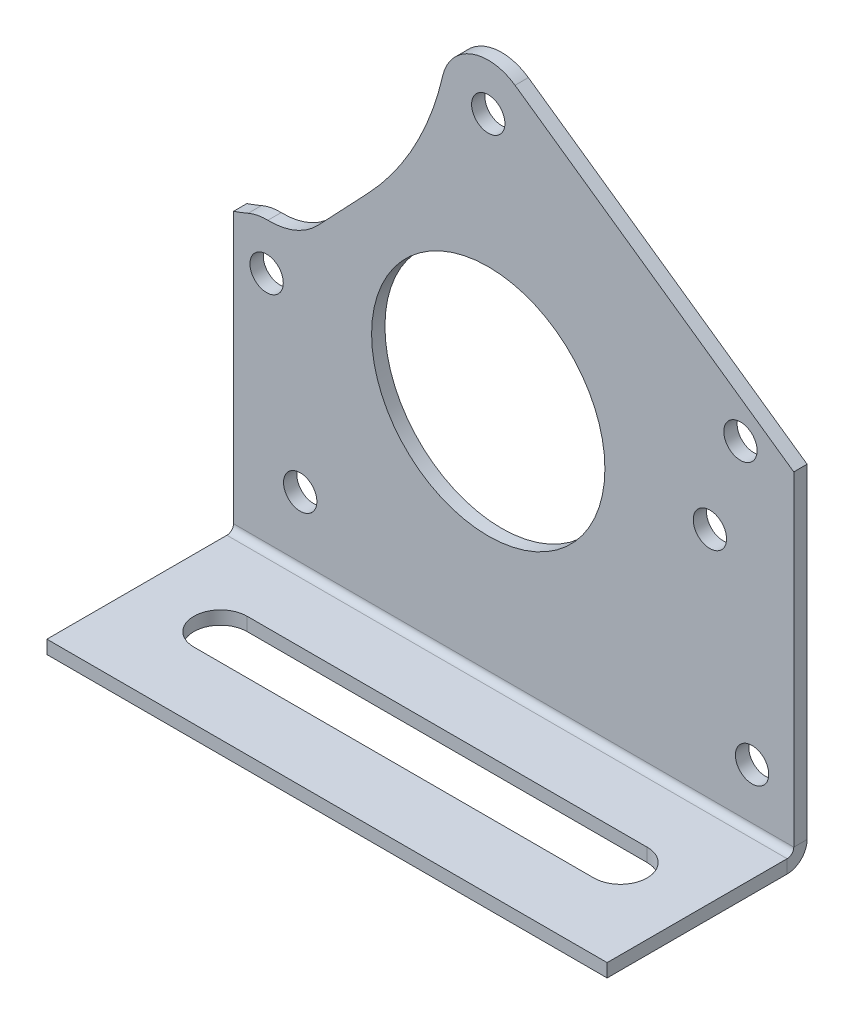
ISO-10303-21;
HEADER;
FILE_DESCRIPTION(('STEP AP214'),'2;1');
FILE_NAME('part.step','',(''),(''),'','','');
FILE_SCHEMA(('AUTOMOTIVE_DESIGN { 1 0 10303 214 1 1 1 1 }'));
ENDSEC;
DATA;
#1=APPLICATION_CONTEXT('core data for automotive mechanical design processes');
#2=APPLICATION_PROTOCOL_DEFINITION('international standard','automotive_design',2000,#1);
#3=PRODUCT_CONTEXT('',#1,'mechanical');
#4=PRODUCT('Part','Part','',(#3));
#5=PRODUCT_RELATED_PRODUCT_CATEGORY('part','',(#4));
#6=PRODUCT_DEFINITION_FORMATION('','',#4);
#7=PRODUCT_DEFINITION_CONTEXT('part definition',#1,'design');
#8=PRODUCT_DEFINITION('design','',#6,#7);
#9=PRODUCT_DEFINITION_SHAPE('','',#8);
#10=(LENGTH_UNIT() NAMED_UNIT(*) SI_UNIT(.MILLI.,.METRE.));
#11=(NAMED_UNIT(*) PLANE_ANGLE_UNIT() SI_UNIT($,.RADIAN.));
#12=(NAMED_UNIT(*) SI_UNIT($,.STERADIAN.) SOLID_ANGLE_UNIT());
#13=UNCERTAINTY_MEASURE_WITH_UNIT(LENGTH_MEASURE(1.E-05),#10,'distance_accuracy_value','');
#14=(GEOMETRIC_REPRESENTATION_CONTEXT(3) GLOBAL_UNCERTAINTY_ASSIGNED_CONTEXT((#13)) GLOBAL_UNIT_ASSIGNED_CONTEXT((#10,
#11,#12)) REPRESENTATION_CONTEXT('',''));
#15=CARTESIAN_POINT('',(0.,0.,0.));
#16=DIRECTION('',(0.,0.,1.));
#17=DIRECTION('',(1.,0.,0.));
#18=AXIS2_PLACEMENT_3D('',#15,#16,#17);
#19=CARTESIAN_POINT('',(-47.8445195193264,34.,0.));
#20=DIRECTION('',(0.,0.,1.));
#21=DIRECTION('',(1.,0.,0.));
#22=AXIS2_PLACEMENT_3D('',#19,#20,#21);
#23=CYLINDRICAL_SURFACE('',#22,30.);
#24=CARTESIAN_POINT('',(-47.8445195193264,34.,0.));
#25=DIRECTION('',(0.,0.,1.));
#26=DIRECTION('',(1.,0.,0.));
#27=AXIS2_PLACEMENT_3D('',#24,#25,#26);
#28=CIRCLE('',#27,30.);
#29=CARTESIAN_POINT('',(-38.2097610551975,5.58923743828941,0.));
#30=VERTEX_POINT('',#29);
#31=CARTESIAN_POINT('',(-36.0111253144672,6.43243243243244,0.));
#32=VERTEX_POINT('',#31);
#33=EDGE_CURVE('E236',#30,#32,#28,.T.);
#34=ORIENTED_EDGE('',*,*,#33,.F.);
#35=DIRECTION('',(0.,0.,-1.));
#36=VECTOR('',#35,1.);
#37=CARTESIAN_POINT('',(-38.2097610551975,5.58923743828941,2.));
#38=LINE('',#37,#36);
#39=CARTESIAN_POINT('',(-38.2097610551975,5.58923743828941,2.));
#40=VERTEX_POINT('',#39);
#41=EDGE_CURVE('E221',#30,#40,#38,.F.);
#42=ORIENTED_EDGE('',*,*,#41,.T.);
#43=CARTESIAN_POINT('',(-47.8445195193264,34.,2.));
#44=DIRECTION('',(0.,0.,1.));
#45=DIRECTION('',(1.,0.,0.));
#46=AXIS2_PLACEMENT_3D('',#43,#44,#45);
#47=CIRCLE('',#46,30.);
#48=CARTESIAN_POINT('',(-36.0111253144672,6.43243243243244,2.));
#49=VERTEX_POINT('',#48);
#50=EDGE_CURVE('E234',#40,#49,#47,.T.);
#51=ORIENTED_EDGE('',*,*,#50,.T.);
#52=DIRECTION('',(0.,0.,-1.));
#53=VECTOR('',#52,1.);
#54=CARTESIAN_POINT('',(-36.0111253144672,6.43243243243244,0.));
#55=LINE('',#54,#53);
#56=EDGE_CURVE('E101',#49,#32,#55,.T.);
#57=ORIENTED_EDGE('',*,*,#56,.T.);
#58=EDGE_LOOP('',(#34,#42,#51,#57));
#59=FACE_BOUND('',#58,.T.);
#60=ADVANCED_FACE('F92',(#59),#23,.F.);
#61=CARTESIAN_POINT('',(0.,0.,0.));
#62=DIRECTION('',(0.,0.,1.));
#63=DIRECTION('',(1.,0.,0.));
#64=AXIS2_PLACEMENT_3D('',#61,#62,#63);
#65=PLANE('',#64);
#66=CARTESIAN_POINT('',(-28.2097610551975,-25.881079341072,0.));
#67=DIRECTION('',(0.,0.,1.));
#68=DIRECTION('',(1.,0.,0.));
#69=AXIS2_PLACEMENT_3D('',#66,#67,#68);
#70=CIRCLE('',#69,2.5);
#71=CARTESIAN_POINT('',(-25.7097610551975,-25.881079341072,0.));
#72=VERTEX_POINT('',#71);
#73=EDGE_CURVE('E428',#72,#72,#70,.T.);
#74=ORIENTED_EDGE('',*,*,#73,.T.);
#75=EDGE_LOOP('',(#74));
#76=FACE_BOUND('',#75,.T.);
#77=CARTESIAN_POINT('',(37.8337760652302,13.7503667638249,0.));
#78=DIRECTION('',(0.,0.,1.));
#79=DIRECTION('',(1.,0.,0.));
#80=AXIS2_PLACEMENT_3D('',#77,#78,#79);
#81=CIRCLE('',#80,2.5);
#82=CARTESIAN_POINT('',(40.3337760652302,13.7503667638249,0.));
#83=VERTEX_POINT('',#82);
#84=EDGE_CURVE('E434',#83,#83,#81,.T.);
#85=ORIENTED_EDGE('',*,*,#84,.T.);
#86=EDGE_LOOP('',(#85));
#87=FACE_BOUND('',#86,.T.);
#88=CARTESIAN_POINT('',(0.,0.,0.));
#89=DIRECTION('',(0.,0.,1.));
#90=DIRECTION('',(1.,0.,0.));
#91=AXIS2_PLACEMENT_3D('',#88,#89,#90);
#92=CIRCLE('',#91,17.5);
#93=CARTESIAN_POINT('',(17.5,0.,0.));
#94=VERTEX_POINT('',#93);
#95=EDGE_CURVE('E312',#94,#94,#92,.T.);
#96=ORIENTED_EDGE('',*,*,#95,.T.);
#97=EDGE_LOOP('',(#96));
#98=FACE_BOUND('',#97,.T.);
#99=CARTESIAN_POINT('',(33.25,0.,0.));
#100=DIRECTION('',(0.,0.,1.));
#101=DIRECTION('',(1.,0.,0.));
#102=AXIS2_PLACEMENT_3D('',#99,#100,#101);
#103=CIRCLE('',#102,2.5);
#104=CARTESIAN_POINT('',(35.75,0.,0.));
#105=VERTEX_POINT('',#104);
#106=EDGE_CURVE('E309',#105,#105,#103,.T.);
#107=ORIENTED_EDGE('',*,*,#106,.T.);
#108=EDGE_LOOP('',(#107));
#109=FACE_BOUND('',#108,.T.);
#110=CARTESIAN_POINT('',(0.,37.3421678535138,0.));
#111=DIRECTION('',(0.,0.,1.));
#112=DIRECTION('',(1.,0.,0.));
#113=AXIS2_PLACEMENT_3D('',#110,#111,#112);
#114=CIRCLE('',#113,2.49999999999999);
#115=CARTESIAN_POINT('',(2.5,37.3421678535138,0.));
#116=VERTEX_POINT('',#115);
#117=EDGE_CURVE('E306',#116,#116,#114,.T.);
#118=ORIENTED_EDGE('',*,*,#117,.T.);
#119=EDGE_LOOP('',(#118));
#120=FACE_BOUND('',#119,.T.);
#121=CARTESIAN_POINT('',(-33.25,0.,0.));
#122=DIRECTION('',(0.,0.,1.));
#123=DIRECTION('',(1.,0.,0.));
#124=AXIS2_PLACEMENT_3D('',#121,#122,#123);
#125=CIRCLE('',#124,2.5);
#126=CARTESIAN_POINT('',(-30.75,0.,0.));
#127=VERTEX_POINT('',#126);
#128=EDGE_CURVE('E303',#127,#127,#125,.T.);
#129=ORIENTED_EDGE('',*,*,#128,.T.);
#130=EDGE_LOOP('',(#129));
#131=FACE_BOUND('',#130,.T.);
#132=CARTESIAN_POINT('',(39.578078905262,-27.4129692688268,0.));
#133=DIRECTION('',(0.,0.,1.));
#134=DIRECTION('',(1.,0.,0.));
#135=AXIS2_PLACEMENT_3D('',#132,#133,#134);
#136=CIRCLE('',#135,2.5);
#137=CARTESIAN_POINT('',(42.078078905262,-27.4129692688268,0.));
#138=VERTEX_POINT('',#137);
#139=EDGE_CURVE('E409',#138,#138,#136,.F.);
#140=ORIENTED_EDGE('',*,*,#139,.F.);
#141=EDGE_LOOP('',(#140));
#142=FACE_BOUND('',#141,.T.);
#143=DIRECTION('',(0.,1.,0.));
#144=VECTOR('',#143,1.);
#145=CARTESIAN_POINT('',(-38.2097610551975,-10.7354096589151,0.));
#146=LINE('',#145,#144);
#147=CARTESIAN_POINT('',(-38.2097610551975,-35.,0.));
#148=VERTEX_POINT('',#147);
#149=EDGE_CURVE('E229',#30,#148,#146,.F.);
#150=ORIENTED_EDGE('',*,*,#149,.F.);
#151=ORIENTED_EDGE('',*,*,#33,.T.);
#152=CARTESIAN_POINT('',(-33.25,0.,0.));
#153=DIRECTION('',(0.,0.,1.));
#154=DIRECTION('',(1.,0.,0.));
#155=AXIS2_PLACEMENT_3D('',#152,#153,#154);
#156=CIRCLE('',#155,7.);
#157=CARTESIAN_POINT('',(-33.0587999247616,6.99738826500494,0.));
#158=VERTEX_POINT('',#157);
#159=EDGE_CURVE('E282',#158,#32,#156,.T.);
#160=ORIENTED_EDGE('',*,*,#159,.F.);
#161=CARTESIAN_POINT('',(-32.7856569601353,16.993657215012,0.));
#162=DIRECTION('',(0.,0.,1.));
#163=DIRECTION('',(1.,0.,0.));
#164=AXIS2_PLACEMENT_3D('',#161,#162,#163);
#165=CIRCLE('',#164,10.);
#166=CARTESIAN_POINT('',(-25.5286011289523,10.1136033879628,0.));
#167=VERTEX_POINT('',#166);
#168=EDGE_CURVE('E287',#158,#167,#165,.T.);
#169=ORIENTED_EDGE('',*,*,#168,.T.);
#170=DIRECTION('',(0.688005382704915,0.725705583118294,0.));
#171=VECTOR('',#170,1.);
#172=CARTESIAN_POINT('',(-18.49421631113,17.5334469886425,0.));
#173=LINE('',#172,#171);
#174=CARTESIAN_POINT('',(-18.0213576485873,18.0322165914092,0.));
#175=VERTEX_POINT('',#174);
#176=EDGE_CURVE('E289',#167,#175,#173,.T.);
#177=ORIENTED_EDGE('',*,*,#176,.T.);
#178=CARTESIAN_POINT('',(-50.6781088889106,48.9924588131304,0.));
#179=DIRECTION('',(0.,0.,1.));
#180=DIRECTION('',(1.,0.,0.));
#181=AXIS2_PLACEMENT_3D('',#178,#179,#180);
#182=CIRCLE('',#181,45.);
#183=CARTESIAN_POINT('',(-6.82205311966103,38.9104762519237,0.));
#184=VERTEX_POINT('',#183);
#185=EDGE_CURVE('E297',#175,#184,#182,.T.);
#186=ORIENTED_EDGE('',*,*,#185,.T.);
#187=CARTESIAN_POINT('',(0.,37.3421678535138,0.));
#188=DIRECTION('',(0.,0.,1.));
#189=DIRECTION('',(1.,0.,0.));
#190=AXIS2_PLACEMENT_3D('',#187,#188,#189);
#191=CIRCLE('',#190,7.);
#192=CARTESIAN_POINT('',(4.01908677570395,43.0733929833933,0.));
#193=VERTEX_POINT('',#192);
#194=EDGE_CURVE('E300',#193,#184,#191,.T.);
#195=ORIENTED_EDGE('',*,*,#194,.F.);
#196=DIRECTION('',(-0.818746447125636,0.574155253671991,0.));
#197=VECTOR('',#196,1.);
#198=CARTESIAN_POINT('',(21.5731758714486,30.7633884476405,0.));
#199=LINE('',#198,#197);
#200=CARTESIAN_POINT('',(45.8337760652302,13.7503667638249,0.));
#201=VERTEX_POINT('',#200);
#202=EDGE_CURVE('E268',#201,#193,#199,.T.);
#203=ORIENTED_EDGE('',*,*,#202,.F.);
#204=DIRECTION('',(0.,1.,0.));
#205=VECTOR('',#204,1.);
#206=CARTESIAN_POINT('',(45.8337760652302,13.7503667638249,0.));
#207=LINE('',#206,#205);
#208=CARTESIAN_POINT('',(45.8337760652302,-35.,0.));
#209=VERTEX_POINT('',#208);
#210=EDGE_CURVE('E346',#209,#201,#207,.T.);
#211=ORIENTED_EDGE('',*,*,#210,.F.);
#212=DIRECTION('',(-1.,0.,0.));
#213=VECTOR('',#212,1.);
#214=CARTESIAN_POINT('',(0.,-35.,0.));
#215=LINE('',#214,#213);
#216=EDGE_CURVE('E291',#209,#148,#215,.T.);
#217=ORIENTED_EDGE('',*,*,#216,.T.);
#218=EDGE_LOOP('',(#150,#151,#160,#169,#177,#186,#195,#203,#211,#217));
#219=FACE_BOUND('',#218,.T.);
#220=ADVANCED_FACE('F334',(#76,#87,#98,#109,#120,#131,#142,#219),#65,.F.);
#221=CARTESIAN_POINT('',(0.,0.,2.));
#222=DIRECTION('',(0.,0.,1.));
#223=DIRECTION('',(1.,0.,0.));
#224=AXIS2_PLACEMENT_3D('',#221,#222,#223);
#225=PLANE('',#224);
#226=CARTESIAN_POINT('',(-28.2097610551975,-25.881079341072,2.));
#227=DIRECTION('',(0.,0.,1.));
#228=DIRECTION('',(1.,0.,0.));
#229=AXIS2_PLACEMENT_3D('',#226,#227,#228);
#230=CIRCLE('',#229,2.5);
#231=CARTESIAN_POINT('',(-25.7097610551975,-25.881079341072,2.));
#232=VERTEX_POINT('',#231);
#233=EDGE_CURVE('E437',#232,#232,#230,.T.);
#234=ORIENTED_EDGE('',*,*,#233,.F.);
#235=EDGE_LOOP('',(#234));
#236=FACE_BOUND('',#235,.T.);
#237=CARTESIAN_POINT('',(37.8337760652302,13.7503667638249,2.));
#238=DIRECTION('',(0.,0.,1.));
#239=DIRECTION('',(1.,0.,0.));
#240=AXIS2_PLACEMENT_3D('',#237,#238,#239);
#241=CIRCLE('',#240,2.5);
#242=CARTESIAN_POINT('',(40.3337760652302,13.7503667638249,2.));
#243=VERTEX_POINT('',#242);
#244=EDGE_CURVE('E431',#243,#243,#241,.T.);
#245=ORIENTED_EDGE('',*,*,#244,.F.);
#246=EDGE_LOOP('',(#245));
#247=FACE_BOUND('',#246,.T.);
#248=CARTESIAN_POINT('',(0.,0.,2.));
#249=DIRECTION('',(0.,0.,1.));
#250=DIRECTION('',(1.,0.,0.));
#251=AXIS2_PLACEMENT_3D('',#248,#249,#250);
#252=CIRCLE('',#251,17.5);
#253=CARTESIAN_POINT('',(17.5,0.,2.));
#254=VERTEX_POINT('',#253);
#255=EDGE_CURVE('E265',#254,#254,#252,.T.);
#256=ORIENTED_EDGE('',*,*,#255,.F.);
#257=EDGE_LOOP('',(#256));
#258=FACE_BOUND('',#257,.T.);
#259=CARTESIAN_POINT('',(33.25,0.,2.));
#260=DIRECTION('',(0.,0.,1.));
#261=DIRECTION('',(1.,0.,0.));
#262=AXIS2_PLACEMENT_3D('',#259,#260,#261);
#263=CIRCLE('',#262,2.5);
#264=CARTESIAN_POINT('',(35.75,0.,2.));
#265=VERTEX_POINT('',#264);
#266=EDGE_CURVE('E262',#265,#265,#263,.T.);
#267=ORIENTED_EDGE('',*,*,#266,.F.);
#268=EDGE_LOOP('',(#267));
#269=FACE_BOUND('',#268,.T.);
#270=CARTESIAN_POINT('',(0.,37.3421678535138,2.));
#271=DIRECTION('',(0.,0.,1.));
#272=DIRECTION('',(1.,0.,0.));
#273=AXIS2_PLACEMENT_3D('',#270,#271,#272);
#274=CIRCLE('',#273,2.49999999999999);
#275=CARTESIAN_POINT('',(2.5,37.3421678535138,2.));
#276=VERTEX_POINT('',#275);
#277=EDGE_CURVE('E258',#276,#276,#274,.T.);
#278=ORIENTED_EDGE('',*,*,#277,.F.);
#279=EDGE_LOOP('',(#278));
#280=FACE_BOUND('',#279,.T.);
#281=CARTESIAN_POINT('',(-33.25,0.,2.));
#282=DIRECTION('',(0.,0.,1.));
#283=DIRECTION('',(1.,0.,0.));
#284=AXIS2_PLACEMENT_3D('',#281,#282,#283);
#285=CIRCLE('',#284,2.5);
#286=CARTESIAN_POINT('',(-30.75,0.,2.));
#287=VERTEX_POINT('',#286);
#288=EDGE_CURVE('E255',#287,#287,#285,.T.);
#289=ORIENTED_EDGE('',*,*,#288,.F.);
#290=EDGE_LOOP('',(#289));
#291=FACE_BOUND('',#290,.T.);
#292=CARTESIAN_POINT('',(39.578078905262,-27.4129692688268,2.));
#293=DIRECTION('',(0.,0.,1.));
#294=DIRECTION('',(1.,0.,0.));
#295=AXIS2_PLACEMENT_3D('',#292,#293,#294);
#296=CIRCLE('',#295,2.5);
#297=CARTESIAN_POINT('',(42.078078905262,-27.4129692688268,2.));
#298=VERTEX_POINT('',#297);
#299=EDGE_CURVE('E412',#298,#298,#296,.T.);
#300=ORIENTED_EDGE('',*,*,#299,.F.);
#301=EDGE_LOOP('',(#300));
#302=FACE_BOUND('',#301,.T.);
#303=ORIENTED_EDGE('',*,*,#50,.F.);
#304=DIRECTION('',(0.,-1.,0.));
#305=VECTOR('',#304,1.);
#306=CARTESIAN_POINT('',(-38.2097610551975,0.,2.));
#307=LINE('',#306,#305);
#308=CARTESIAN_POINT('',(-38.2097610551975,-35.,2.));
#309=VERTEX_POINT('',#308);
#310=EDGE_CURVE('E218',#40,#309,#307,.T.);
#311=ORIENTED_EDGE('',*,*,#310,.T.);
#312=DIRECTION('',(1.,0.,0.));
#313=VECTOR('',#312,1.);
#314=CARTESIAN_POINT('',(0.,-35.,2.));
#315=LINE('',#314,#313);
#316=CARTESIAN_POINT('',(45.8337760652302,-35.,2.));
#317=VERTEX_POINT('',#316);
#318=EDGE_CURVE('E244',#317,#309,#315,.F.);
#319=ORIENTED_EDGE('',*,*,#318,.F.);
#320=DIRECTION('',(0.,1.,0.));
#321=VECTOR('',#320,1.);
#322=CARTESIAN_POINT('',(45.8337760652302,0.,2.));
#323=LINE('',#322,#321);
#324=CARTESIAN_POINT('',(45.8337760652302,13.7503667638249,2.));
#325=VERTEX_POINT('',#324);
#326=EDGE_CURVE('E248',#317,#325,#323,.T.);
#327=ORIENTED_EDGE('',*,*,#326,.T.);
#328=DIRECTION('',(-0.818746447125636,0.574155253671991,0.));
#329=VECTOR('',#328,1.);
#330=CARTESIAN_POINT('',(21.5731758714486,30.7633884476405,2.));
#331=LINE('',#330,#329);
#332=CARTESIAN_POINT('',(4.01908677570395,43.0733929833933,2.));
#333=VERTEX_POINT('',#332);
#334=EDGE_CURVE('E254',#325,#333,#331,.T.);
#335=ORIENTED_EDGE('',*,*,#334,.T.);
#336=CARTESIAN_POINT('',(0.,37.3421678535138,2.));
#337=DIRECTION('',(0.,0.,1.));
#338=DIRECTION('',(1.,0.,0.));
#339=AXIS2_PLACEMENT_3D('',#336,#337,#338);
#340=CIRCLE('',#339,7.);
#341=CARTESIAN_POINT('',(-6.82205311966103,38.9104762519237,2.));
#342=VERTEX_POINT('',#341);
#343=EDGE_CURVE('E259',#333,#342,#340,.T.);
#344=ORIENTED_EDGE('',*,*,#343,.T.);
#345=CARTESIAN_POINT('',(-50.6781088889106,48.9924588131304,2.));
#346=DIRECTION('',(0.,0.,1.));
#347=DIRECTION('',(1.,0.,0.));
#348=AXIS2_PLACEMENT_3D('',#345,#346,#347);
#349=CIRCLE('',#348,45.);
#350=CARTESIAN_POINT('',(-18.0213576485873,18.0322165914092,2.));
#351=VERTEX_POINT('',#350);
#352=EDGE_CURVE('E320',#351,#342,#349,.T.);
#353=ORIENTED_EDGE('',*,*,#352,.F.);
#354=DIRECTION('',(0.688005382704915,0.725705583118294,0.));
#355=VECTOR('',#354,1.);
#356=CARTESIAN_POINT('',(-18.49421631113,17.5334469886425,2.));
#357=LINE('',#356,#355);
#358=CARTESIAN_POINT('',(-25.5286011289523,10.1136033879628,2.));
#359=VERTEX_POINT('',#358);
#360=EDGE_CURVE('E323',#359,#351,#357,.T.);
#361=ORIENTED_EDGE('',*,*,#360,.F.);
#362=CARTESIAN_POINT('',(-32.7856569601353,16.993657215012,2.));
#363=DIRECTION('',(0.,0.,1.));
#364=DIRECTION('',(1.,0.,0.));
#365=AXIS2_PLACEMENT_3D('',#362,#363,#364);
#366=CIRCLE('',#365,10.);
#367=CARTESIAN_POINT('',(-33.0587999247616,6.99738826500494,2.));
#368=VERTEX_POINT('',#367);
#369=EDGE_CURVE('E246',#368,#359,#366,.T.);
#370=ORIENTED_EDGE('',*,*,#369,.F.);
#371=CARTESIAN_POINT('',(-33.25,0.,2.));
#372=DIRECTION('',(0.,0.,1.));
#373=DIRECTION('',(1.,0.,0.));
#374=AXIS2_PLACEMENT_3D('',#371,#372,#373);
#375=CIRCLE('',#374,7.);
#376=EDGE_CURVE('E243',#368,#49,#375,.T.);
#377=ORIENTED_EDGE('',*,*,#376,.T.);
#378=EDGE_LOOP('',(#303,#311,#319,#327,#335,#344,#353,#361,#370,#377));
#379=FACE_BOUND('',#378,.T.);
#380=ADVANCED_FACE('F240',(#236,#247,#258,#269,#280,#291,#302,#379),#225,.T.);
#381=CARTESIAN_POINT('',(45.8337760652302,-35.,3.));
#382=DIRECTION('',(1.,0.,0.));
#383=DIRECTION('',(0.,-1.,0.));
#384=AXIS2_PLACEMENT_3D('',#381,#382,#383);
#385=CYLINDRICAL_SURFACE('',#384,3.);
#386=DIRECTION('',(1.,0.,0.));
#387=VECTOR('',#386,1.);
#388=CARTESIAN_POINT('',(0.,-38.,2.99999999999999));
#389=LINE('',#388,#387);
#390=CARTESIAN_POINT('',(-38.2097610551975,-38.,2.99999999999999));
#391=VERTEX_POINT('',#390);
#392=CARTESIAN_POINT('',(45.8337760652302,-38.,2.99999999999999));
#393=VERTEX_POINT('',#392);
#394=EDGE_CURVE('E366',#391,#393,#389,.T.);
#395=ORIENTED_EDGE('',*,*,#394,.F.);
#396=CARTESIAN_POINT('',(-38.2097610551975,-35.,3.));
#397=DIRECTION('',(1.,0.,0.));
#398=DIRECTION('',(0.,0.,-1.));
#399=AXIS2_PLACEMENT_3D('',#396,#397,#398);
#400=CIRCLE('',#399,3.);
#401=EDGE_CURVE('E237',#148,#391,#400,.F.);
#402=ORIENTED_EDGE('',*,*,#401,.F.);
#403=ORIENTED_EDGE('',*,*,#216,.F.);
#404=CARTESIAN_POINT('',(45.8337760652302,-35.,3.));
#405=DIRECTION('',(1.,0.,0.));
#406=DIRECTION('',(0.,0.,-1.));
#407=AXIS2_PLACEMENT_3D('',#404,#405,#406);
#408=CIRCLE('',#407,3.);
#409=EDGE_CURVE('E317',#393,#209,#408,.T.);
#410=ORIENTED_EDGE('',*,*,#409,.F.);
#411=EDGE_LOOP('',(#395,#402,#403,#410));
#412=FACE_BOUND('',#411,.T.);
#413=ADVANCED_FACE('F454',(#412),#385,.T.);
#414=CARTESIAN_POINT('',(45.8337760652302,-35.,3.));
#415=DIRECTION('',(1.,0.,0.));
#416=DIRECTION('',(0.,-1.,0.));
#417=AXIS2_PLACEMENT_3D('',#414,#415,#416);
#418=CYLINDRICAL_SURFACE('',#417,1.);
#419=CARTESIAN_POINT('',(-38.2097610551975,-35.,3.));
#420=DIRECTION('',(1.,0.,0.));
#421=DIRECTION('',(0.,0.,-1.));
#422=AXIS2_PLACEMENT_3D('',#419,#420,#421);
#423=CIRCLE('',#422,1.);
#424=CARTESIAN_POINT('',(-38.2097610551975,-36.,3.));
#425=VERTEX_POINT('',#424);
#426=EDGE_CURVE('E417',#309,#425,#423,.F.);
#427=ORIENTED_EDGE('',*,*,#426,.T.);
#428=DIRECTION('',(-1.,0.,0.));
#429=VECTOR('',#428,1.);
#430=CARTESIAN_POINT('',(-113.209761055198,-36.,3.));
#431=LINE('',#430,#429);
#432=CARTESIAN_POINT('',(45.8337760652302,-36.,3.));
#433=VERTEX_POINT('',#432);
#434=EDGE_CURVE('E360',#425,#433,#431,.F.);
#435=ORIENTED_EDGE('',*,*,#434,.T.);
#436=CARTESIAN_POINT('',(45.8337760652302,-35.,3.));
#437=DIRECTION('',(1.,0.,0.));
#438=DIRECTION('',(0.,0.,-1.));
#439=AXIS2_PLACEMENT_3D('',#436,#437,#438);
#440=CIRCLE('',#439,1.);
#441=EDGE_CURVE('E354',#433,#317,#440,.T.);
#442=ORIENTED_EDGE('',*,*,#441,.T.);
#443=ORIENTED_EDGE('',*,*,#318,.T.);
#444=EDGE_LOOP('',(#427,#435,#442,#443));
#445=FACE_BOUND('',#444,.T.);
#446=ADVANCED_FACE('F558',(#445),#418,.F.);
#447=CARTESIAN_POINT('',(0.,-38.,-1.28413605996063E-13));
#448=DIRECTION('',(0.,-1.,0.));
#449=DIRECTION('',(0.,0.,-1.));
#450=AXIS2_PLACEMENT_3D('',#447,#448,#449);
#451=PLANE('',#450);
#452=CARTESIAN_POINT('',(-26.1662239347698,-38.,16.));
#453=DIRECTION('',(0.,-1.,0.));
#454=DIRECTION('',(0.,0.,-1.));
#455=AXIS2_PLACEMENT_3D('',#452,#453,#454);
#456=CIRCLE('',#455,4.);
#457=CARTESIAN_POINT('',(-26.1662239347698,-38.,12.));
#458=VERTEX_POINT('',#457);
#459=CARTESIAN_POINT('',(-26.1662239347698,-38.0000000000001,20.));
#460=VERTEX_POINT('',#459);
#461=EDGE_CURVE('E400',#458,#460,#456,.F.);
#462=ORIENTED_EDGE('',*,*,#461,.T.);
#463=DIRECTION('',(1.,0.,0.));
#464=VECTOR('',#463,1.);
#465=CARTESIAN_POINT('',(-26.1662239347698,-38.0000000000001,20.));
#466=LINE('',#465,#464);
#467=CARTESIAN_POINT('',(33.8337760652302,-38.0000000000001,20.));
#468=VERTEX_POINT('',#467);
#469=EDGE_CURVE('E363',#460,#468,#466,.T.);
#470=ORIENTED_EDGE('',*,*,#469,.T.);
#471=CARTESIAN_POINT('',(33.8337760652302,-38.,16.));
#472=DIRECTION('',(0.,-1.,0.));
#473=DIRECTION('',(0.,0.,-1.));
#474=AXIS2_PLACEMENT_3D('',#471,#472,#473);
#475=CIRCLE('',#474,4.);
#476=CARTESIAN_POINT('',(33.8337760652302,-38.,12.));
#477=VERTEX_POINT('',#476);
#478=EDGE_CURVE('E406',#468,#477,#475,.F.);
#479=ORIENTED_EDGE('',*,*,#478,.T.);
#480=DIRECTION('',(-1.,0.,0.));
#481=VECTOR('',#480,1.);
#482=CARTESIAN_POINT('',(-26.1662239347698,-38.,12.));
#483=LINE('',#482,#481);
#484=EDGE_CURVE('E403',#477,#458,#483,.T.);
#485=ORIENTED_EDGE('',*,*,#484,.T.);
#486=EDGE_LOOP('',(#462,#470,#479,#485));
#487=FACE_BOUND('',#486,.T.);
#488=DIRECTION('',(1.,0.,0.));
#489=VECTOR('',#488,1.);
#490=CARTESIAN_POINT('',(45.8337760652302,-38.0000000000001,30.));
#491=LINE('',#490,#489);
#492=CARTESIAN_POINT('',(-38.2097610551975,-38.0000000000001,30.));
#493=VERTEX_POINT('',#492);
#494=CARTESIAN_POINT('',(45.8337760652302,-38.0000000000001,30.));
#495=VERTEX_POINT('',#494);
#496=EDGE_CURVE('E373',#493,#495,#491,.T.);
#497=ORIENTED_EDGE('',*,*,#496,.F.);
#498=DIRECTION('',(0.,0.,-1.));
#499=VECTOR('',#498,1.);
#500=CARTESIAN_POINT('',(-38.2097610551975,-38.,-1.28369537222284E-13));
#501=LINE('',#500,#499);
#502=EDGE_CURVE('E108',#493,#391,#501,.T.);
#503=ORIENTED_EDGE('',*,*,#502,.T.);
#504=ORIENTED_EDGE('',*,*,#394,.T.);
#505=DIRECTION('',(0.,0.,-1.));
#506=VECTOR('',#505,1.);
#507=CARTESIAN_POINT('',(45.8337760652302,-38.,1.99999999999999));
#508=LINE('',#507,#506);
#509=EDGE_CURVE('E375',#495,#393,#508,.T.);
#510=ORIENTED_EDGE('',*,*,#509,.F.);
#511=EDGE_LOOP('',(#497,#503,#504,#510));
#512=FACE_BOUND('',#511,.T.);
#513=ADVANCED_FACE('F551',(#487,#512),#451,.T.);
#514=CARTESIAN_POINT('',(0.,-36.,-1.21430643318376E-13));
#515=DIRECTION('',(0.,-1.,0.));
#516=DIRECTION('',(0.,0.,-1.));
#517=AXIS2_PLACEMENT_3D('',#514,#515,#516);
#518=PLANE('',#517);
#519=DIRECTION('',(1.,0.,0.));
#520=VECTOR('',#519,1.);
#521=CARTESIAN_POINT('',(-26.1662239347698,-35.9999999999999,20.));
#522=LINE('',#521,#520);
#523=CARTESIAN_POINT('',(-26.1662239347698,-36.0000000000001,20.));
#524=VERTEX_POINT('',#523);
#525=CARTESIAN_POINT('',(33.8337760652302,-35.9999999999999,20.));
#526=VERTEX_POINT('',#525);
#527=EDGE_CURVE('E396',#524,#526,#522,.T.);
#528=ORIENTED_EDGE('',*,*,#527,.F.);
#529=CARTESIAN_POINT('',(-26.1662239347698,-35.9999999999999,16.));
#530=DIRECTION('',(0.,1.,0.));
#531=DIRECTION('',(0.,0.,1.));
#532=AXIS2_PLACEMENT_3D('',#529,#530,#531);
#533=CIRCLE('',#532,4.);
#534=CARTESIAN_POINT('',(-26.1662239347698,-36.,12.));
#535=VERTEX_POINT('',#534);
#536=EDGE_CURVE('E398',#535,#524,#533,.T.);
#537=ORIENTED_EDGE('',*,*,#536,.F.);
#538=DIRECTION('',(-1.,0.,0.));
#539=VECTOR('',#538,1.);
#540=CARTESIAN_POINT('',(-26.1662239347698,-36.,12.));
#541=LINE('',#540,#539);
#542=CARTESIAN_POINT('',(33.8337760652302,-36.,12.));
#543=VERTEX_POINT('',#542);
#544=EDGE_CURVE('E386',#543,#535,#541,.T.);
#545=ORIENTED_EDGE('',*,*,#544,.F.);
#546=CARTESIAN_POINT('',(33.8337760652302,-35.9999999999999,16.));
#547=DIRECTION('',(0.,1.,0.));
#548=DIRECTION('',(0.,0.,1.));
#549=AXIS2_PLACEMENT_3D('',#546,#547,#548);
#550=CIRCLE('',#549,4.);
#551=EDGE_CURVE('E393',#526,#543,#550,.T.);
#552=ORIENTED_EDGE('',*,*,#551,.F.);
#553=EDGE_LOOP('',(#528,#537,#545,#552));
#554=FACE_BOUND('',#553,.T.);
#555=DIRECTION('',(0.,0.,1.));
#556=VECTOR('',#555,1.);
#557=CARTESIAN_POINT('',(-38.2097610551975,-36.,16.5));
#558=LINE('',#557,#556);
#559=CARTESIAN_POINT('',(-38.2097610551975,-36.0000000000001,30.));
#560=VERTEX_POINT('',#559);
#561=EDGE_CURVE('E426',#560,#425,#558,.F.);
#562=ORIENTED_EDGE('',*,*,#561,.F.);
#563=DIRECTION('',(-1.,0.,0.));
#564=VECTOR('',#563,1.);
#565=CARTESIAN_POINT('',(0.,-36.0000000000001,30.));
#566=LINE('',#565,#564);
#567=CARTESIAN_POINT('',(45.8337760652302,-36.0000000000001,30.));
#568=VERTEX_POINT('',#567);
#569=EDGE_CURVE('E368',#560,#568,#566,.F.);
#570=ORIENTED_EDGE('',*,*,#569,.T.);
#571=DIRECTION('',(0.,0.,1.));
#572=VECTOR('',#571,1.);
#573=CARTESIAN_POINT('',(45.8337760652302,-36.,0.));
#574=LINE('',#573,#572);
#575=EDGE_CURVE('E370',#568,#433,#574,.F.);
#576=ORIENTED_EDGE('',*,*,#575,.T.);
#577=ORIENTED_EDGE('',*,*,#434,.F.);
#578=EDGE_LOOP('',(#562,#570,#576,#577));
#579=FACE_BOUND('',#578,.T.);
#580=ADVANCED_FACE('F545',(#554,#579),#518,.F.);
#581=CARTESIAN_POINT('',(45.8337760652302,-38.0000000000001,30.));
#582=DIRECTION('',(0.,0.,1.));
#583=DIRECTION('',(0.,-1.,0.));
#584=AXIS2_PLACEMENT_3D('',#581,#582,#583);
#585=PLANE('',#584);
#586=ORIENTED_EDGE('',*,*,#569,.F.);
#587=DIRECTION('',(0.,1.,0.));
#588=VECTOR('',#587,1.);
#589=CARTESIAN_POINT('',(-38.2097610551975,-38.0000000000001,30.));
#590=LINE('',#589,#588);
#591=EDGE_CURVE('E424',#560,#493,#590,.F.);
#592=ORIENTED_EDGE('',*,*,#591,.T.);
#593=ORIENTED_EDGE('',*,*,#496,.T.);
#594=DIRECTION('',(0.,1.,0.));
#595=VECTOR('',#594,1.);
#596=CARTESIAN_POINT('',(45.8337760652302,-38.0000000000001,30.));
#597=LINE('',#596,#595);
#598=EDGE_CURVE('E357',#495,#568,#597,.T.);
#599=ORIENTED_EDGE('',*,*,#598,.T.);
#600=EDGE_LOOP('',(#586,#592,#593,#599));
#601=FACE_BOUND('',#600,.T.);
#602=ADVANCED_FACE('F497',(#601),#585,.T.);
#603=CARTESIAN_POINT('',(-33.25,0.,0.));
#604=DIRECTION('',(0.,0.,1.));
#605=DIRECTION('',(1.,0.,0.));
#606=AXIS2_PLACEMENT_3D('',#603,#604,#605);
#607=CYLINDRICAL_SURFACE('',#606,7.);
#608=ORIENTED_EDGE('',*,*,#56,.F.);
#609=ORIENTED_EDGE('',*,*,#376,.F.);
#610=DIRECTION('',(0.,0.,-1.));
#611=VECTOR('',#610,1.);
#612=CARTESIAN_POINT('',(-33.0587999247616,6.99738826500494,0.));
#613=LINE('',#612,#611);
#614=EDGE_CURVE('E277',#368,#158,#613,.T.);
#615=ORIENTED_EDGE('',*,*,#614,.T.);
#616=ORIENTED_EDGE('',*,*,#159,.T.);
#617=EDGE_LOOP('',(#608,#609,#615,#616));
#618=FACE_BOUND('',#617,.T.);
#619=ADVANCED_FACE('F283',(#618),#607,.T.);
#620=CARTESIAN_POINT('',(-32.7856569601353,16.993657215012,0.));
#621=DIRECTION('',(0.,0.,1.));
#622=DIRECTION('',(1.,0.,0.));
#623=AXIS2_PLACEMENT_3D('',#620,#621,#622);
#624=CYLINDRICAL_SURFACE('',#623,10.);
#625=ORIENTED_EDGE('',*,*,#614,.F.);
#626=ORIENTED_EDGE('',*,*,#369,.T.);
#627=DIRECTION('',(0.,0.,-1.));
#628=VECTOR('',#627,1.);
#629=CARTESIAN_POINT('',(-25.5286011289523,10.1136033879628,0.));
#630=LINE('',#629,#628);
#631=EDGE_CURVE('E275',#359,#167,#630,.T.);
#632=ORIENTED_EDGE('',*,*,#631,.T.);
#633=ORIENTED_EDGE('',*,*,#168,.F.);
#634=EDGE_LOOP('',(#625,#626,#632,#633));
#635=FACE_BOUND('',#634,.T.);
#636=ADVANCED_FACE('F327',(#635),#624,.F.);
#637=CARTESIAN_POINT('',(-18.49421631113,17.5334469886425,0.));
#638=DIRECTION('',(0.725705583118294,-0.688005382704915,0.));
#639=DIRECTION('',(0.688005382704915,0.725705583118294,0.));
#640=AXIS2_PLACEMENT_3D('',#637,#638,#639);
#641=PLANE('',#640);
#642=ORIENTED_EDGE('',*,*,#631,.F.);
#643=ORIENTED_EDGE('',*,*,#360,.T.);
#644=DIRECTION('',(0.,0.,-1.));
#645=VECTOR('',#644,1.);
#646=CARTESIAN_POINT('',(-18.0213576485873,18.0322165914092,0.));
#647=LINE('',#646,#645);
#648=EDGE_CURVE('E273',#351,#175,#647,.T.);
#649=ORIENTED_EDGE('',*,*,#648,.T.);
#650=ORIENTED_EDGE('',*,*,#176,.F.);
#651=EDGE_LOOP('',(#642,#643,#649,#650));
#652=FACE_BOUND('',#651,.T.);
#653=ADVANCED_FACE('F331',(#652),#641,.F.);
#654=CARTESIAN_POINT('',(-50.6781088889106,48.9924588131304,0.));
#655=DIRECTION('',(0.,0.,1.));
#656=DIRECTION('',(1.,0.,0.));
#657=AXIS2_PLACEMENT_3D('',#654,#655,#656);
#658=CYLINDRICAL_SURFACE('',#657,45.);
#659=ORIENTED_EDGE('',*,*,#648,.F.);
#660=ORIENTED_EDGE('',*,*,#352,.T.);
#661=DIRECTION('',(0.,0.,-1.));
#662=VECTOR('',#661,1.);
#663=CARTESIAN_POINT('',(-6.82205311966103,38.9104762519237,0.));
#664=LINE('',#663,#662);
#665=EDGE_CURVE('E271',#342,#184,#664,.T.);
#666=ORIENTED_EDGE('',*,*,#665,.T.);
#667=ORIENTED_EDGE('',*,*,#185,.F.);
#668=EDGE_LOOP('',(#659,#660,#666,#667));
#669=FACE_BOUND('',#668,.T.);
#670=ADVANCED_FACE('F337',(#669),#658,.F.);
#671=CARTESIAN_POINT('',(0.,37.3421678535138,0.));
#672=DIRECTION('',(0.,0.,1.));
#673=DIRECTION('',(1.,0.,0.));
#674=AXIS2_PLACEMENT_3D('',#671,#672,#673);
#675=CYLINDRICAL_SURFACE('',#674,7.);
#676=ORIENTED_EDGE('',*,*,#665,.F.);
#677=ORIENTED_EDGE('',*,*,#343,.F.);
#678=DIRECTION('',(0.,0.,-1.));
#679=VECTOR('',#678,1.);
#680=CARTESIAN_POINT('',(4.01908677570395,43.0733929833933,0.));
#681=LINE('',#680,#679);
#682=EDGE_CURVE('E269',#333,#193,#681,.T.);
#683=ORIENTED_EDGE('',*,*,#682,.T.);
#684=ORIENTED_EDGE('',*,*,#194,.T.);
#685=EDGE_LOOP('',(#676,#677,#683,#684));
#686=FACE_BOUND('',#685,.T.);
#687=ADVANCED_FACE('F340',(#686),#675,.T.);
#688=CARTESIAN_POINT('',(21.5731758714486,30.7633884476405,0.));
#689=DIRECTION('',(0.574155253671991,0.818746447125636,0.));
#690=DIRECTION('',(-0.818746447125636,0.574155253671991,0.));
#691=AXIS2_PLACEMENT_3D('',#688,#689,#690);
#692=PLANE('',#691);
#693=ORIENTED_EDGE('',*,*,#682,.F.);
#694=ORIENTED_EDGE('',*,*,#334,.F.);
#695=DIRECTION('',(0.,0.,-1.));
#696=VECTOR('',#695,1.);
#697=CARTESIAN_POINT('',(45.8337760652302,13.7503667638249,0.));
#698=LINE('',#697,#696);
#699=EDGE_CURVE('E96',#325,#201,#698,.T.);
#700=ORIENTED_EDGE('',*,*,#699,.T.);
#701=ORIENTED_EDGE('',*,*,#202,.T.);
#702=EDGE_LOOP('',(#693,#694,#700,#701));
#703=FACE_BOUND('',#702,.T.);
#704=ADVANCED_FACE('F485',(#703),#692,.T.);
#705=CARTESIAN_POINT('',(45.8337760652302,13.7503667638249,0.));
#706=DIRECTION('',(1.,0.,0.));
#707=DIRECTION('',(0.,1.,0.));
#708=AXIS2_PLACEMENT_3D('',#705,#706,#707);
#709=PLANE('',#708);
#710=ORIENTED_EDGE('',*,*,#326,.F.);
#711=DIRECTION('',(0.,0.,-1.));
#712=VECTOR('',#711,1.);
#713=CARTESIAN_POINT('',(45.8337760652302,-35.,0.));
#714=LINE('',#713,#712);
#715=EDGE_CURVE('E13',#317,#209,#714,.T.);
#716=ORIENTED_EDGE('',*,*,#715,.T.);
#717=ORIENTED_EDGE('',*,*,#210,.T.);
#718=ORIENTED_EDGE('',*,*,#699,.F.);
#719=EDGE_LOOP('',(#710,#716,#717,#718));
#720=FACE_BOUND('',#719,.T.);
#721=ADVANCED_FACE('F351',(#720),#709,.T.);
#722=CARTESIAN_POINT('',(-33.25,0.,0.));
#723=DIRECTION('',(0.,0.,1.));
#724=DIRECTION('',(1.,0.,0.));
#725=AXIS2_PLACEMENT_3D('',#722,#723,#724);
#726=CYLINDRICAL_SURFACE('',#725,2.5);
#727=ORIENTED_EDGE('',*,*,#128,.F.);
#728=EDGE_LOOP('',(#727));
#729=FACE_BOUND('',#728,.T.);
#730=ORIENTED_EDGE('',*,*,#288,.T.);
#731=EDGE_LOOP('',(#730));
#732=FACE_BOUND('',#731,.T.);
#733=ADVANCED_FACE('F501',(#729,#732),#726,.F.);
#734=CARTESIAN_POINT('',(0.,37.3421678535138,0.));
#735=DIRECTION('',(0.,0.,1.));
#736=DIRECTION('',(1.,0.,0.));
#737=AXIS2_PLACEMENT_3D('',#734,#735,#736);
#738=CYLINDRICAL_SURFACE('',#737,2.49999999999999);
#739=ORIENTED_EDGE('',*,*,#117,.F.);
#740=EDGE_LOOP('',(#739));
#741=FACE_BOUND('',#740,.T.);
#742=ORIENTED_EDGE('',*,*,#277,.T.);
#743=EDGE_LOOP('',(#742));
#744=FACE_BOUND('',#743,.T.);
#745=ADVANCED_FACE('F504',(#741,#744),#738,.F.);
#746=CARTESIAN_POINT('',(33.25,0.,0.));
#747=DIRECTION('',(0.,0.,1.));
#748=DIRECTION('',(1.,0.,0.));
#749=AXIS2_PLACEMENT_3D('',#746,#747,#748);
#750=CYLINDRICAL_SURFACE('',#749,2.5);
#751=ORIENTED_EDGE('',*,*,#106,.F.);
#752=EDGE_LOOP('',(#751));
#753=FACE_BOUND('',#752,.T.);
#754=ORIENTED_EDGE('',*,*,#266,.T.);
#755=EDGE_LOOP('',(#754));
#756=FACE_BOUND('',#755,.T.);
#757=ADVANCED_FACE('F507',(#753,#756),#750,.F.);
#758=CARTESIAN_POINT('',(0.,0.,0.));
#759=DIRECTION('',(0.,0.,1.));
#760=DIRECTION('',(1.,0.,0.));
#761=AXIS2_PLACEMENT_3D('',#758,#759,#760);
#762=CYLINDRICAL_SURFACE('',#761,17.5);
#763=ORIENTED_EDGE('',*,*,#95,.F.);
#764=EDGE_LOOP('',(#763));
#765=FACE_BOUND('',#764,.T.);
#766=ORIENTED_EDGE('',*,*,#255,.T.);
#767=EDGE_LOOP('',(#766));
#768=FACE_BOUND('',#767,.T.);
#769=ADVANCED_FACE('F94',(#765,#768),#762,.F.);
#770=CARTESIAN_POINT('',(45.8337760652302,-35.,3.));
#771=DIRECTION('',(-1.,0.,0.));
#772=DIRECTION('',(0.,0.,1.));
#773=AXIS2_PLACEMENT_3D('',#770,#771,#772);
#774=PLANE('',#773);
#775=ORIENTED_EDGE('',*,*,#441,.F.);
#776=DIRECTION('',(0.,-1.,0.));
#777=VECTOR('',#776,1.);
#778=CARTESIAN_POINT('',(45.8337760652302,-36.,3.));
#779=LINE('',#778,#777);
#780=EDGE_CURVE('E362',#433,#393,#779,.T.);
#781=ORIENTED_EDGE('',*,*,#780,.T.);
#782=ORIENTED_EDGE('',*,*,#409,.T.);
#783=ORIENTED_EDGE('',*,*,#715,.F.);
#784=EDGE_LOOP('',(#775,#781,#782,#783));
#785=FACE_BOUND('',#784,.T.);
#786=ADVANCED_FACE('F482',(#785),#774,.F.);
#787=CARTESIAN_POINT('',(45.8337760652302,-38.,1.99999999999999));
#788=DIRECTION('',(1.,0.,0.));
#789=DIRECTION('',(0.,0.,-1.));
#790=AXIS2_PLACEMENT_3D('',#787,#788,#789);
#791=PLANE('',#790);
#792=ORIENTED_EDGE('',*,*,#509,.T.);
#793=ORIENTED_EDGE('',*,*,#780,.F.);
#794=ORIENTED_EDGE('',*,*,#575,.F.);
#795=ORIENTED_EDGE('',*,*,#598,.F.);
#796=EDGE_LOOP('',(#792,#793,#794,#795));
#797=FACE_BOUND('',#796,.T.);
#798=ADVANCED_FACE('F527',(#797),#791,.T.);
#799=CARTESIAN_POINT('',(-26.1662239347698,-38.0010000000001,16.));
#800=DIRECTION('',(0.,1.,0.));
#801=DIRECTION('',(0.,0.,1.));
#802=AXIS2_PLACEMENT_3D('',#799,#800,#801);
#803=CYLINDRICAL_SURFACE('',#802,4.);
#804=DIRECTION('',(0.,1.,0.));
#805=VECTOR('',#804,1.);
#806=CARTESIAN_POINT('',(-26.1662239347698,-38.0010000000002,12.));
#807=LINE('',#806,#805);
#808=EDGE_CURVE('E382',#458,#535,#807,.T.);
#809=ORIENTED_EDGE('',*,*,#808,.T.);
#810=ORIENTED_EDGE('',*,*,#536,.T.);
#811=DIRECTION('',(0.,1.,0.));
#812=VECTOR('',#811,1.);
#813=CARTESIAN_POINT('',(-26.1662239347698,-38.0010000000001,20.));
#814=LINE('',#813,#812);
#815=EDGE_CURVE('E383',#460,#524,#814,.T.);
#816=ORIENTED_EDGE('',*,*,#815,.F.);
#817=ORIENTED_EDGE('',*,*,#461,.F.);
#818=EDGE_LOOP('',(#809,#810,#816,#817));
#819=FACE_BOUND('',#818,.T.);
#820=ADVANCED_FACE('F535',(#819),#803,.F.);
#821=CARTESIAN_POINT('',(-26.1662239347698,-38.0010000000002,12.));
#822=DIRECTION('',(0.,0.,-1.));
#823=DIRECTION('',(0.,1.,0.));
#824=AXIS2_PLACEMENT_3D('',#821,#822,#823);
#825=PLANE('',#824);
#826=DIRECTION('',(0.,1.,0.));
#827=VECTOR('',#826,1.);
#828=CARTESIAN_POINT('',(33.8337760652302,-38.0010000000002,12.));
#829=LINE('',#828,#827);
#830=EDGE_CURVE('E388',#477,#543,#829,.T.);
#831=ORIENTED_EDGE('',*,*,#830,.T.);
#832=ORIENTED_EDGE('',*,*,#544,.T.);
#833=ORIENTED_EDGE('',*,*,#808,.F.);
#834=ORIENTED_EDGE('',*,*,#484,.F.);
#835=EDGE_LOOP('',(#831,#832,#833,#834));
#836=FACE_BOUND('',#835,.T.);
#837=ADVANCED_FACE('F577',(#836),#825,.F.);
#838=CARTESIAN_POINT('',(33.8337760652302,-38.0010000000001,16.));
#839=DIRECTION('',(0.,1.,0.));
#840=DIRECTION('',(0.,0.,1.));
#841=AXIS2_PLACEMENT_3D('',#838,#839,#840);
#842=CYLINDRICAL_SURFACE('',#841,4.);
#843=DIRECTION('',(0.,1.,0.));
#844=VECTOR('',#843,1.);
#845=CARTESIAN_POINT('',(33.8337760652302,-38.0010000000001,20.));
#846=LINE('',#845,#844);
#847=EDGE_CURVE('E116',#468,#526,#846,.T.);
#848=ORIENTED_EDGE('',*,*,#847,.T.);
#849=ORIENTED_EDGE('',*,*,#551,.T.);
#850=ORIENTED_EDGE('',*,*,#830,.F.);
#851=ORIENTED_EDGE('',*,*,#478,.F.);
#852=EDGE_LOOP('',(#848,#849,#850,#851));
#853=FACE_BOUND('',#852,.T.);
#854=ADVANCED_FACE('F581',(#853),#842,.F.);
#855=CARTESIAN_POINT('',(-26.1662239347698,-38.0010000000001,20.));
#856=DIRECTION('',(0.,0.,1.));
#857=DIRECTION('',(0.,-1.,0.));
#858=AXIS2_PLACEMENT_3D('',#855,#856,#857);
#859=PLANE('',#858);
#860=ORIENTED_EDGE('',*,*,#815,.T.);
#861=ORIENTED_EDGE('',*,*,#527,.T.);
#862=ORIENTED_EDGE('',*,*,#847,.F.);
#863=ORIENTED_EDGE('',*,*,#469,.F.);
#864=EDGE_LOOP('',(#860,#861,#862,#863));
#865=FACE_BOUND('',#864,.T.);
#866=ADVANCED_FACE('F471',(#865),#859,.F.);
#867=CARTESIAN_POINT('',(39.578078905262,-27.4129692688268,-0.00100000000000187));
#868=DIRECTION('',(0.,0.,1.));
#869=DIRECTION('',(1.,0.,0.));
#870=AXIS2_PLACEMENT_3D('',#867,#868,#869);
#871=CYLINDRICAL_SURFACE('',#870,2.5);
#872=ORIENTED_EDGE('',*,*,#299,.T.);
#873=EDGE_LOOP('',(#872));
#874=FACE_BOUND('',#873,.T.);
#875=ORIENTED_EDGE('',*,*,#139,.T.);
#876=EDGE_LOOP('',(#875));
#877=FACE_BOUND('',#876,.T.);
#878=ADVANCED_FACE('F468',(#874,#877),#871,.F.);
#879=CARTESIAN_POINT('',(-38.2097610551975,0.,2.));
#880=DIRECTION('',(1.,0.,0.));
#881=DIRECTION('',(0.,-1.,0.));
#882=AXIS2_PLACEMENT_3D('',#879,#880,#881);
#883=PLANE('',#882);
#884=ORIENTED_EDGE('',*,*,#41,.F.);
#885=ORIENTED_EDGE('',*,*,#149,.T.);
#886=DIRECTION('',(0.,0.,-1.));
#887=VECTOR('',#886,1.);
#888=CARTESIAN_POINT('',(-38.2097610551975,-35.,0.));
#889=LINE('',#888,#887);
#890=EDGE_CURVE('E224',#148,#309,#889,.F.);
#891=ORIENTED_EDGE('',*,*,#890,.T.);
#892=ORIENTED_EDGE('',*,*,#310,.F.);
#893=EDGE_LOOP('',(#884,#885,#891,#892));
#894=FACE_BOUND('',#893,.T.);
#895=ADVANCED_FACE('F220',(#894),#883,.F.);
#896=CARTESIAN_POINT('',(-38.2097610551975,-35.,3.));
#897=DIRECTION('',(-1.,0.,0.));
#898=DIRECTION('',(0.,0.,1.));
#899=AXIS2_PLACEMENT_3D('',#896,#897,#898);
#900=PLANE('',#899);
#901=ORIENTED_EDGE('',*,*,#401,.T.);
#902=DIRECTION('',(0.,-1.,0.));
#903=VECTOR('',#902,1.);
#904=CARTESIAN_POINT('',(-38.2097610551975,-38.,2.99999999999999));
#905=LINE('',#904,#903);
#906=EDGE_CURVE('E415',#391,#425,#905,.F.);
#907=ORIENTED_EDGE('',*,*,#906,.T.);
#908=ORIENTED_EDGE('',*,*,#426,.F.);
#909=ORIENTED_EDGE('',*,*,#890,.F.);
#910=EDGE_LOOP('',(#901,#907,#908,#909));
#911=FACE_BOUND('',#910,.T.);
#912=ADVANCED_FACE('F557',(#911),#900,.T.);
#913=CARTESIAN_POINT('',(-38.2097610551975,-38.,-1.28369537222284E-13));
#914=DIRECTION('',(1.,0.,0.));
#915=DIRECTION('',(0.,0.,-1.));
#916=AXIS2_PLACEMENT_3D('',#913,#914,#915);
#917=PLANE('',#916);
#918=ORIENTED_EDGE('',*,*,#561,.T.);
#919=ORIENTED_EDGE('',*,*,#906,.F.);
#920=ORIENTED_EDGE('',*,*,#502,.F.);
#921=ORIENTED_EDGE('',*,*,#591,.F.);
#922=EDGE_LOOP('',(#918,#919,#920,#921));
#923=FACE_BOUND('',#922,.T.);
#924=ADVANCED_FACE('F590',(#923),#917,.F.);
#925=CARTESIAN_POINT('',(37.8337760652302,13.7503667638249,0.));
#926=DIRECTION('',(0.,0.,1.));
#927=DIRECTION('',(1.,0.,0.));
#928=AXIS2_PLACEMENT_3D('',#925,#926,#927);
#929=CYLINDRICAL_SURFACE('',#928,2.5);
#930=ORIENTED_EDGE('',*,*,#84,.F.);
#931=EDGE_LOOP('',(#930));
#932=FACE_BOUND('',#931,.T.);
#933=ORIENTED_EDGE('',*,*,#244,.T.);
#934=EDGE_LOOP('',(#933));
#935=FACE_BOUND('',#934,.T.);
#936=ADVANCED_FACE('F448',(#932,#935),#929,.F.);
#937=CARTESIAN_POINT('',(-28.2097610551975,-25.881079341072,0.));
#938=DIRECTION('',(0.,0.,1.));
#939=DIRECTION('',(1.,0.,0.));
#940=AXIS2_PLACEMENT_3D('',#937,#938,#939);
#941=CYLINDRICAL_SURFACE('',#940,2.5);
#942=ORIENTED_EDGE('',*,*,#73,.F.);
#943=EDGE_LOOP('',(#942));
#944=FACE_BOUND('',#943,.T.);
#945=ORIENTED_EDGE('',*,*,#233,.T.);
#946=EDGE_LOOP('',(#945));
#947=FACE_BOUND('',#946,.T.);
#948=ADVANCED_FACE('F445',(#944,#947),#941,.F.);
#949=CLOSED_SHELL('',(#60,#220,#380,#413,#446,#513,#580,#602,#619,#636,#653,#670,#687,#704,#721,
#733,#745,#757,#769,#786,#798,#820,#837,#854,#866,#878,#895,#912,#924,#936,#948));
#950=MANIFOLD_SOLID_BREP('B2',#949);
#951=ADVANCED_BREP_SHAPE_REPRESENTATION('',(#18,#950),#14);
#952=SHAPE_DEFINITION_REPRESENTATION(#9,#951);
ENDSEC;
END-ISO-10303-21;
